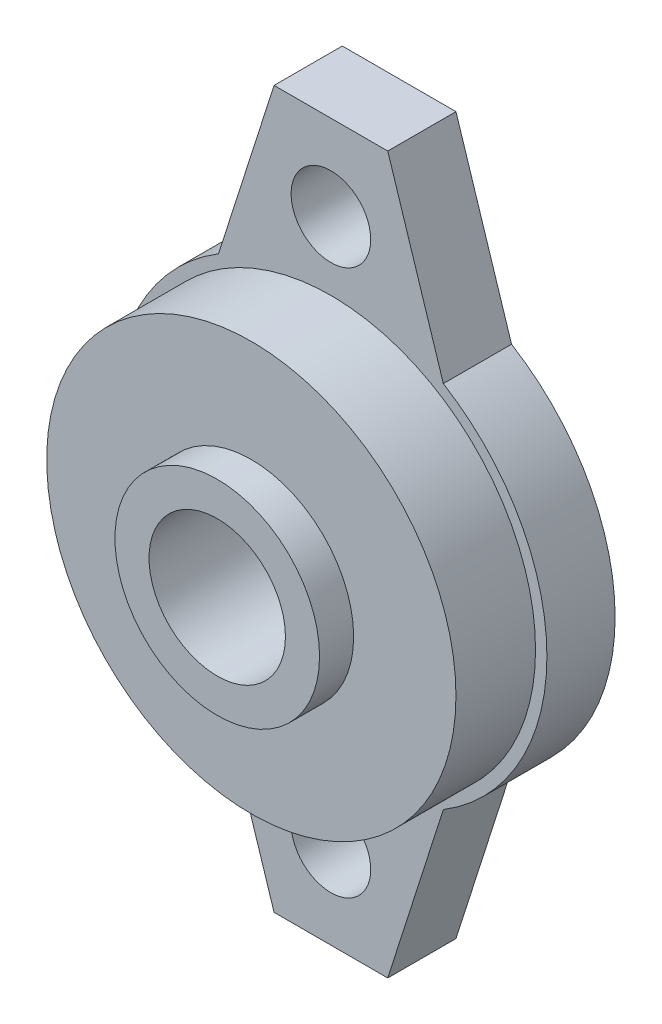
ISO-10303-21;
HEADER;
FILE_DESCRIPTION(('STEP AP214'),'2;1');
FILE_NAME('part.step','',(''),(''),'','','');
FILE_SCHEMA(('AUTOMOTIVE_DESIGN { 1 0 10303 214 1 1 1 1 }'));
ENDSEC;
DATA;
#1=APPLICATION_CONTEXT('core data for automotive mechanical design processes');
#2=APPLICATION_PROTOCOL_DEFINITION('international standard','automotive_design',2000,#1);
#3=PRODUCT_CONTEXT('',#1,'mechanical');
#4=PRODUCT('Part','Part','',(#3));
#5=PRODUCT_RELATED_PRODUCT_CATEGORY('part','',(#4));
#6=PRODUCT_DEFINITION_FORMATION('','',#4);
#7=PRODUCT_DEFINITION_CONTEXT('part definition',#1,'design');
#8=PRODUCT_DEFINITION('design','',#6,#7);
#9=PRODUCT_DEFINITION_SHAPE('','',#8);
#10=(LENGTH_UNIT() NAMED_UNIT(*) SI_UNIT(.MILLI.,.METRE.));
#11=(NAMED_UNIT(*) PLANE_ANGLE_UNIT() SI_UNIT($,.RADIAN.));
#12=(NAMED_UNIT(*) SI_UNIT($,.STERADIAN.) SOLID_ANGLE_UNIT());
#13=UNCERTAINTY_MEASURE_WITH_UNIT(LENGTH_MEASURE(1.E-05),#10,'distance_accuracy_value','');
#14=(GEOMETRIC_REPRESENTATION_CONTEXT(3) GLOBAL_UNCERTAINTY_ASSIGNED_CONTEXT((#13)) GLOBAL_UNIT_ASSIGNED_CONTEXT((#10,
#11,#12)) REPRESENTATION_CONTEXT('',''));
#15=CARTESIAN_POINT('',(0.,0.,0.));
#16=DIRECTION('',(0.,0.,1.));
#17=DIRECTION('',(1.,0.,0.));
#18=AXIS2_PLACEMENT_3D('',#15,#16,#17);
#19=CARTESIAN_POINT('',(0.,0.,6.));
#20=DIRECTION('',(0.,0.,1.));
#21=DIRECTION('',(1.,0.,0.));
#22=AXIS2_PLACEMENT_3D('',#19,#20,#21);
#23=PLANE('',#22);
#24=CARTESIAN_POINT('',(0.,0.,6.));
#25=DIRECTION('',(0.,0.,1.));
#26=DIRECTION('',(1.,0.,0.));
#27=AXIS2_PLACEMENT_3D('',#24,#25,#26);
#28=CIRCLE('',#27,18.);
#29=CARTESIAN_POINT('',(18.,0.,6.));
#30=VERTEX_POINT('',#29);
#31=EDGE_CURVE('E202',#30,#30,#28,.T.);
#32=ORIENTED_EDGE('',*,*,#31,.F.);
#33=EDGE_LOOP('',(#32));
#34=FACE_BOUND('',#33,.T.);
#35=CARTESIAN_POINT('',(0.,-24.,6.));
#36=DIRECTION('',(0.,0.,1.));
#37=DIRECTION('',(1.,0.,0.));
#38=AXIS2_PLACEMENT_3D('',#35,#36,#37);
#39=CIRCLE('',#38,3.5);
#40=CARTESIAN_POINT('',(3.5,-24.,6.));
#41=VERTEX_POINT('',#40);
#42=EDGE_CURVE('E190',#41,#41,#39,.T.);
#43=ORIENTED_EDGE('',*,*,#42,.F.);
#44=EDGE_LOOP('',(#43));
#45=FACE_BOUND('',#44,.T.);
#46=CARTESIAN_POINT('',(0.,0.,6.));
#47=DIRECTION('',(0.,0.,1.));
#48=DIRECTION('',(1.,0.,0.));
#49=AXIS2_PLACEMENT_3D('',#46,#47,#48);
#50=CIRCLE('',#49,19.);
#51=CARTESIAN_POINT('',(-9.8882838392303,16.2241130024053,6.));
#52=VERTEX_POINT('',#51);
#53=CARTESIAN_POINT('',(-9.8882838392303,-16.2241130024053,6.));
#54=VERTEX_POINT('',#53);
#55=EDGE_CURVE('E150',#52,#54,#50,.T.);
#56=ORIENTED_EDGE('',*,*,#55,.T.);
#57=DIRECTION('',(0.304775727103784,-0.952424147199324,0.));
#58=VECTOR('',#57,1.);
#59=CARTESIAN_POINT('',(-5.,-31.5,6.));
#60=LINE('',#59,#58);
#61=CARTESIAN_POINT('',(-5.,-31.5,6.));
#62=VERTEX_POINT('',#61);
#63=EDGE_CURVE('E98',#54,#62,#60,.T.);
#64=ORIENTED_EDGE('',*,*,#63,.T.);
#65=DIRECTION('',(1.,0.,0.));
#66=VECTOR('',#65,1.);
#67=CARTESIAN_POINT('',(-5.,-31.5,6.));
#68=LINE('',#67,#66);
#69=CARTESIAN_POINT('',(5.,-31.5,6.));
#70=VERTEX_POINT('',#69);
#71=EDGE_CURVE('E181',#62,#70,#68,.T.);
#72=ORIENTED_EDGE('',*,*,#71,.T.);
#73=DIRECTION('',(0.304775727103784,0.952424147199324,0.));
#74=VECTOR('',#73,1.);
#75=CARTESIAN_POINT('',(5.,-31.5,6.));
#76=LINE('',#75,#74);
#77=CARTESIAN_POINT('',(9.8882838392303,-16.2241130024053,6.));
#78=VERTEX_POINT('',#77);
#79=EDGE_CURVE('E180',#70,#78,#76,.T.);
#80=ORIENTED_EDGE('',*,*,#79,.T.);
#81=CARTESIAN_POINT('',(0.,0.,6.));
#82=DIRECTION('',(0.,0.,1.));
#83=DIRECTION('',(1.,0.,0.));
#84=AXIS2_PLACEMENT_3D('',#81,#82,#83);
#85=CIRCLE('',#84,19.);
#86=CARTESIAN_POINT('',(9.8882838392303,16.2241130024053,6.));
#87=VERTEX_POINT('',#86);
#88=EDGE_CURVE('E117',#78,#87,#85,.T.);
#89=ORIENTED_EDGE('',*,*,#88,.T.);
#90=DIRECTION('',(-0.304775727103784,0.952424147199324,0.));
#91=VECTOR('',#90,1.);
#92=CARTESIAN_POINT('',(5.,31.5,6.));
#93=LINE('',#92,#91);
#94=CARTESIAN_POINT('',(5.,31.5,6.));
#95=VERTEX_POINT('',#94);
#96=EDGE_CURVE('E111',#87,#95,#93,.T.);
#97=ORIENTED_EDGE('',*,*,#96,.T.);
#98=DIRECTION('',(-1.,0.,0.));
#99=VECTOR('',#98,1.);
#100=CARTESIAN_POINT('',(-5.,31.5,6.));
#101=LINE('',#100,#99);
#102=CARTESIAN_POINT('',(-5.,31.5,6.));
#103=VERTEX_POINT('',#102);
#104=EDGE_CURVE('E115',#95,#103,#101,.T.);
#105=ORIENTED_EDGE('',*,*,#104,.T.);
#106=DIRECTION('',(-0.304775727103784,-0.952424147199324,0.));
#107=VECTOR('',#106,1.);
#108=CARTESIAN_POINT('',(-5.,31.5,6.));
#109=LINE('',#108,#107);
#110=EDGE_CURVE('E54',#103,#52,#109,.T.);
#111=ORIENTED_EDGE('',*,*,#110,.T.);
#112=EDGE_LOOP('',(#56,#64,#72,#80,#89,#97,#105,#111));
#113=FACE_BOUND('',#112,.T.);
#114=CARTESIAN_POINT('',(0.,24.,6.));
#115=DIRECTION('',(0.,0.,1.));
#116=DIRECTION('',(1.,0.,0.));
#117=AXIS2_PLACEMENT_3D('',#114,#115,#116);
#118=CIRCLE('',#117,3.5);
#119=CARTESIAN_POINT('',(3.5,24.,6.));
#120=VERTEX_POINT('',#119);
#121=EDGE_CURVE('E139',#120,#120,#118,.T.);
#122=ORIENTED_EDGE('',*,*,#121,.F.);
#123=EDGE_LOOP('',(#122));
#124=FACE_BOUND('',#123,.T.);
#125=ADVANCED_FACE('F36',(#34,#45,#113,#124),#23,.T.);
#126=CARTESIAN_POINT('',(0.,0.,0.));
#127=DIRECTION('',(0.,0.,1.));
#128=DIRECTION('',(1.,0.,0.));
#129=AXIS2_PLACEMENT_3D('',#126,#127,#128);
#130=PLANE('',#129);
#131=CARTESIAN_POINT('',(0.,0.,0.));
#132=DIRECTION('',(0.,0.,1.));
#133=DIRECTION('',(1.,0.,0.));
#134=AXIS2_PLACEMENT_3D('',#131,#132,#133);
#135=CIRCLE('',#134,19.);
#136=CARTESIAN_POINT('',(-9.8882838392303,16.2241130024053,0.));
#137=VERTEX_POINT('',#136);
#138=CARTESIAN_POINT('',(-9.8882838392303,-16.2241130024053,0.));
#139=VERTEX_POINT('',#138);
#140=EDGE_CURVE('E135',#137,#139,#135,.T.);
#141=ORIENTED_EDGE('',*,*,#140,.F.);
#142=DIRECTION('',(-0.304775727103784,-0.952424147199324,0.));
#143=VECTOR('',#142,1.);
#144=CARTESIAN_POINT('',(-5.,31.5,0.));
#145=LINE('',#144,#143);
#146=CARTESIAN_POINT('',(-5.,31.5,0.));
#147=VERTEX_POINT('',#146);
#148=EDGE_CURVE('E89',#147,#137,#145,.T.);
#149=ORIENTED_EDGE('',*,*,#148,.F.);
#150=DIRECTION('',(-1.,0.,0.));
#151=VECTOR('',#150,1.);
#152=CARTESIAN_POINT('',(-5.,31.5,0.));
#153=LINE('',#152,#151);
#154=CARTESIAN_POINT('',(5.,31.5,0.));
#155=VERTEX_POINT('',#154);
#156=EDGE_CURVE('E83',#155,#147,#153,.T.);
#157=ORIENTED_EDGE('',*,*,#156,.F.);
#158=DIRECTION('',(-0.304775727103784,0.952424147199324,0.));
#159=VECTOR('',#158,1.);
#160=CARTESIAN_POINT('',(5.,31.5,0.));
#161=LINE('',#160,#159);
#162=CARTESIAN_POINT('',(9.8882838392303,16.2241130024053,0.));
#163=VERTEX_POINT('',#162);
#164=EDGE_CURVE('E125',#163,#155,#161,.T.);
#165=ORIENTED_EDGE('',*,*,#164,.F.);
#166=CARTESIAN_POINT('',(0.,0.,0.));
#167=DIRECTION('',(0.,0.,1.));
#168=DIRECTION('',(1.,0.,0.));
#169=AXIS2_PLACEMENT_3D('',#166,#167,#168);
#170=CIRCLE('',#169,19.);
#171=CARTESIAN_POINT('',(9.8882838392303,-16.2241130024053,0.));
#172=VERTEX_POINT('',#171);
#173=EDGE_CURVE('E145',#172,#163,#170,.T.);
#174=ORIENTED_EDGE('',*,*,#173,.F.);
#175=DIRECTION('',(0.304775727103784,0.952424147199324,0.));
#176=VECTOR('',#175,1.);
#177=CARTESIAN_POINT('',(5.,-31.5,0.));
#178=LINE('',#177,#176);
#179=CARTESIAN_POINT('',(5.,-31.5,0.));
#180=VERTEX_POINT('',#179);
#181=EDGE_CURVE('E143',#180,#172,#178,.T.);
#182=ORIENTED_EDGE('',*,*,#181,.F.);
#183=DIRECTION('',(1.,0.,0.));
#184=VECTOR('',#183,1.);
#185=CARTESIAN_POINT('',(-5.,-31.5,0.));
#186=LINE('',#185,#184);
#187=CARTESIAN_POINT('',(-5.,-31.5,0.));
#188=VERTEX_POINT('',#187);
#189=EDGE_CURVE('E141',#188,#180,#186,.T.);
#190=ORIENTED_EDGE('',*,*,#189,.F.);
#191=DIRECTION('',(0.304775727103784,-0.952424147199324,0.));
#192=VECTOR('',#191,1.);
#193=CARTESIAN_POINT('',(-5.,-31.5,0.));
#194=LINE('',#193,#192);
#195=EDGE_CURVE('E138',#139,#188,#194,.T.);
#196=ORIENTED_EDGE('',*,*,#195,.F.);
#197=EDGE_LOOP('',(#141,#149,#157,#165,#174,#182,#190,#196));
#198=FACE_BOUND('',#197,.T.);
#199=CARTESIAN_POINT('',(0.,24.,0.));
#200=DIRECTION('',(0.,0.,1.));
#201=DIRECTION('',(1.,0.,0.));
#202=AXIS2_PLACEMENT_3D('',#199,#200,#201);
#203=CIRCLE('',#202,3.5);
#204=CARTESIAN_POINT('',(3.5,24.,0.));
#205=VERTEX_POINT('',#204);
#206=EDGE_CURVE('E187',#205,#205,#203,.T.);
#207=ORIENTED_EDGE('',*,*,#206,.T.);
#208=EDGE_LOOP('',(#207));
#209=FACE_BOUND('',#208,.T.);
#210=CARTESIAN_POINT('',(0.,-24.,0.));
#211=DIRECTION('',(0.,0.,1.));
#212=DIRECTION('',(1.,0.,0.));
#213=AXIS2_PLACEMENT_3D('',#210,#211,#212);
#214=CIRCLE('',#213,3.5);
#215=CARTESIAN_POINT('',(3.5,-24.,0.));
#216=VERTEX_POINT('',#215);
#217=EDGE_CURVE('E193',#216,#216,#214,.T.);
#218=ORIENTED_EDGE('',*,*,#217,.T.);
#219=EDGE_LOOP('',(#218));
#220=FACE_BOUND('',#219,.T.);
#221=CARTESIAN_POINT('',(0.,0.,0.));
#222=DIRECTION('',(0.,0.,1.));
#223=DIRECTION('',(1.,0.,0.));
#224=AXIS2_PLACEMENT_3D('',#221,#222,#223);
#225=CIRCLE('',#224,6.);
#226=CARTESIAN_POINT('',(6.,0.,0.));
#227=VERTEX_POINT('',#226);
#228=EDGE_CURVE('E196',#227,#227,#225,.T.);
#229=ORIENTED_EDGE('',*,*,#228,.T.);
#230=EDGE_LOOP('',(#229));
#231=FACE_BOUND('',#230,.T.);
#232=ADVANCED_FACE('F170',(#198,#209,#220,#231),#130,.F.);
#233=CARTESIAN_POINT('',(0.,0.,6.));
#234=DIRECTION('',(0.,0.,-1.));
#235=DIRECTION('',(-1.,0.,0.));
#236=AXIS2_PLACEMENT_3D('',#233,#234,#235);
#237=CYLINDRICAL_SURFACE('',#236,19.);
#238=ORIENTED_EDGE('',*,*,#140,.T.);
#239=DIRECTION('',(0.,0.,-1.));
#240=VECTOR('',#239,1.);
#241=CARTESIAN_POINT('',(-9.8882838392303,-16.2241130024053,6.));
#242=LINE('',#241,#240);
#243=EDGE_CURVE('E40',#54,#139,#242,.T.);
#244=ORIENTED_EDGE('',*,*,#243,.F.);
#245=ORIENTED_EDGE('',*,*,#55,.F.);
#246=DIRECTION('',(0.,0.,-1.));
#247=VECTOR('',#246,1.);
#248=CARTESIAN_POINT('',(-9.8882838392303,16.2241130024053,6.));
#249=LINE('',#248,#247);
#250=EDGE_CURVE('E131',#52,#137,#249,.T.);
#251=ORIENTED_EDGE('',*,*,#250,.T.);
#252=EDGE_LOOP('',(#238,#244,#245,#251));
#253=FACE_BOUND('',#252,.T.);
#254=ADVANCED_FACE('F38',(#253),#237,.T.);
#255=CARTESIAN_POINT('',(-5.,-31.5,6.));
#256=DIRECTION('',(0.952424147199324,0.304775727103783,0.));
#257=DIRECTION('',(-0.304775727103783,0.952424147199324,0.));
#258=AXIS2_PLACEMENT_3D('',#255,#256,#257);
#259=PLANE('',#258);
#260=ORIENTED_EDGE('',*,*,#195,.T.);
#261=DIRECTION('',(0.,0.,-1.));
#262=VECTOR('',#261,1.);
#263=CARTESIAN_POINT('',(-5.,-31.5,6.));
#264=LINE('',#263,#262);
#265=EDGE_CURVE('E159',#62,#188,#264,.T.);
#266=ORIENTED_EDGE('',*,*,#265,.F.);
#267=ORIENTED_EDGE('',*,*,#63,.F.);
#268=ORIENTED_EDGE('',*,*,#243,.T.);
#269=EDGE_LOOP('',(#260,#266,#267,#268));
#270=FACE_BOUND('',#269,.T.);
#271=ADVANCED_FACE('F165',(#270),#259,.F.);
#272=CARTESIAN_POINT('',(-5.,-31.5,6.));
#273=DIRECTION('',(0.,1.,0.));
#274=DIRECTION('',(0.,0.,1.));
#275=AXIS2_PLACEMENT_3D('',#272,#273,#274);
#276=PLANE('',#275);
#277=ORIENTED_EDGE('',*,*,#189,.T.);
#278=DIRECTION('',(0.,0.,-1.));
#279=VECTOR('',#278,1.);
#280=CARTESIAN_POINT('',(5.,-31.5,6.));
#281=LINE('',#280,#279);
#282=EDGE_CURVE('E157',#70,#180,#281,.T.);
#283=ORIENTED_EDGE('',*,*,#282,.F.);
#284=ORIENTED_EDGE('',*,*,#71,.F.);
#285=ORIENTED_EDGE('',*,*,#265,.T.);
#286=EDGE_LOOP('',(#277,#283,#284,#285));
#287=FACE_BOUND('',#286,.T.);
#288=ADVANCED_FACE('F175',(#287),#276,.F.);
#289=CARTESIAN_POINT('',(5.,-31.5,6.));
#290=DIRECTION('',(-0.952424147199324,0.304775727103784,0.));
#291=DIRECTION('',(-0.304775727103784,-0.952424147199324,0.));
#292=AXIS2_PLACEMENT_3D('',#289,#290,#291);
#293=PLANE('',#292);
#294=ORIENTED_EDGE('',*,*,#181,.T.);
#295=DIRECTION('',(0.,0.,-1.));
#296=VECTOR('',#295,1.);
#297=CARTESIAN_POINT('',(9.8882838392303,-16.2241130024053,6.));
#298=LINE('',#297,#296);
#299=EDGE_CURVE('E154',#78,#172,#298,.T.);
#300=ORIENTED_EDGE('',*,*,#299,.F.);
#301=ORIENTED_EDGE('',*,*,#79,.F.);
#302=ORIENTED_EDGE('',*,*,#282,.T.);
#303=EDGE_LOOP('',(#294,#300,#301,#302));
#304=FACE_BOUND('',#303,.T.);
#305=ADVANCED_FACE('F178',(#304),#293,.F.);
#306=CARTESIAN_POINT('',(0.,0.,6.));
#307=DIRECTION('',(0.,0.,-1.));
#308=DIRECTION('',(-1.,0.,0.));
#309=AXIS2_PLACEMENT_3D('',#306,#307,#308);
#310=CYLINDRICAL_SURFACE('',#309,19.);
#311=ORIENTED_EDGE('',*,*,#173,.T.);
#312=DIRECTION('',(0.,0.,-1.));
#313=VECTOR('',#312,1.);
#314=CARTESIAN_POINT('',(9.8882838392303,16.2241130024053,6.));
#315=LINE('',#314,#313);
#316=EDGE_CURVE('E126',#87,#163,#315,.T.);
#317=ORIENTED_EDGE('',*,*,#316,.F.);
#318=ORIENTED_EDGE('',*,*,#88,.F.);
#319=ORIENTED_EDGE('',*,*,#299,.T.);
#320=EDGE_LOOP('',(#311,#317,#318,#319));
#321=FACE_BOUND('',#320,.T.);
#322=ADVANCED_FACE('F272',(#321),#310,.T.);
#323=CARTESIAN_POINT('',(5.,31.5,6.));
#324=DIRECTION('',(-0.952424147199324,-0.304775727103784,0.));
#325=DIRECTION('',(0.304775727103784,-0.952424147199324,0.));
#326=AXIS2_PLACEMENT_3D('',#323,#324,#325);
#327=PLANE('',#326);
#328=ORIENTED_EDGE('',*,*,#164,.T.);
#329=DIRECTION('',(0.,0.,-1.));
#330=VECTOR('',#329,1.);
#331=CARTESIAN_POINT('',(5.,31.5,6.));
#332=LINE('',#331,#330);
#333=EDGE_CURVE('E122',#95,#155,#332,.T.);
#334=ORIENTED_EDGE('',*,*,#333,.F.);
#335=ORIENTED_EDGE('',*,*,#96,.F.);
#336=ORIENTED_EDGE('',*,*,#316,.T.);
#337=EDGE_LOOP('',(#328,#334,#335,#336));
#338=FACE_BOUND('',#337,.T.);
#339=ADVANCED_FACE('F123',(#338),#327,.F.);
#340=CARTESIAN_POINT('',(-5.,31.5,6.));
#341=DIRECTION('',(0.,-1.,0.));
#342=DIRECTION('',(0.,0.,-1.));
#343=AXIS2_PLACEMENT_3D('',#340,#341,#342);
#344=PLANE('',#343);
#345=ORIENTED_EDGE('',*,*,#156,.T.);
#346=DIRECTION('',(0.,0.,-1.));
#347=VECTOR('',#346,1.);
#348=CARTESIAN_POINT('',(-5.,31.5,6.));
#349=LINE('',#348,#347);
#350=EDGE_CURVE('E127',#103,#147,#349,.T.);
#351=ORIENTED_EDGE('',*,*,#350,.F.);
#352=ORIENTED_EDGE('',*,*,#104,.F.);
#353=ORIENTED_EDGE('',*,*,#333,.T.);
#354=EDGE_LOOP('',(#345,#351,#352,#353));
#355=FACE_BOUND('',#354,.T.);
#356=ADVANCED_FACE('F129',(#355),#344,.F.);
#357=CARTESIAN_POINT('',(-5.,31.5,6.));
#358=DIRECTION('',(0.952424147199324,-0.304775727103784,0.));
#359=DIRECTION('',(0.304775727103784,0.952424147199324,0.));
#360=AXIS2_PLACEMENT_3D('',#357,#358,#359);
#361=PLANE('',#360);
#362=ORIENTED_EDGE('',*,*,#148,.T.);
#363=ORIENTED_EDGE('',*,*,#250,.F.);
#364=ORIENTED_EDGE('',*,*,#110,.F.);
#365=ORIENTED_EDGE('',*,*,#350,.T.);
#366=EDGE_LOOP('',(#362,#363,#364,#365));
#367=FACE_BOUND('',#366,.T.);
#368=ADVANCED_FACE('F263',(#367),#361,.F.);
#369=CARTESIAN_POINT('',(0.,24.,6.));
#370=DIRECTION('',(0.,0.,-1.));
#371=DIRECTION('',(-1.,0.,0.));
#372=AXIS2_PLACEMENT_3D('',#369,#370,#371);
#373=CYLINDRICAL_SURFACE('',#372,3.5);
#374=ORIENTED_EDGE('',*,*,#121,.T.);
#375=EDGE_LOOP('',(#374));
#376=FACE_BOUND('',#375,.T.);
#377=ORIENTED_EDGE('',*,*,#206,.F.);
#378=EDGE_LOOP('',(#377));
#379=FACE_BOUND('',#378,.T.);
#380=ADVANCED_FACE('F248',(#376,#379),#373,.F.);
#381=CARTESIAN_POINT('',(0.,-24.,6.));
#382=DIRECTION('',(0.,0.,-1.));
#383=DIRECTION('',(-1.,0.,0.));
#384=AXIS2_PLACEMENT_3D('',#381,#382,#383);
#385=CYLINDRICAL_SURFACE('',#384,3.5);
#386=ORIENTED_EDGE('',*,*,#42,.T.);
#387=EDGE_LOOP('',(#386));
#388=FACE_BOUND('',#387,.T.);
#389=ORIENTED_EDGE('',*,*,#217,.F.);
#390=EDGE_LOOP('',(#389));
#391=FACE_BOUND('',#390,.T.);
#392=ADVANCED_FACE('F245',(#388,#391),#385,.F.);
#393=CARTESIAN_POINT('',(0.,0.,6.));
#394=DIRECTION('',(0.,0.,-1.));
#395=DIRECTION('',(-1.,0.,0.));
#396=AXIS2_PLACEMENT_3D('',#393,#394,#395);
#397=CYLINDRICAL_SURFACE('',#396,6.);
#398=ORIENTED_EDGE('',*,*,#228,.F.);
#399=EDGE_LOOP('',(#398));
#400=FACE_BOUND('',#399,.T.);
#401=CARTESIAN_POINT('',(0.,0.,16.));
#402=DIRECTION('',(0.,0.,1.));
#403=DIRECTION('',(1.,0.,0.));
#404=AXIS2_PLACEMENT_3D('',#401,#402,#403);
#405=CIRCLE('',#404,6.);
#406=CARTESIAN_POINT('',(6.,0.,16.));
#407=VERTEX_POINT('',#406);
#408=EDGE_CURVE('E210',#407,#407,#405,.T.);
#409=ORIENTED_EDGE('',*,*,#408,.T.);
#410=EDGE_LOOP('',(#409));
#411=FACE_BOUND('',#410,.T.);
#412=ADVANCED_FACE('F214',(#400,#411),#397,.F.);
#413=CARTESIAN_POINT('',(0.,0.,13.));
#414=DIRECTION('',(0.,0.,-1.));
#415=DIRECTION('',(-1.,0.,0.));
#416=AXIS2_PLACEMENT_3D('',#413,#414,#415);
#417=CYLINDRICAL_SURFACE('',#416,18.);
#418=CARTESIAN_POINT('',(0.,0.,13.));
#419=DIRECTION('',(0.,0.,1.));
#420=DIRECTION('',(1.,0.,0.));
#421=AXIS2_PLACEMENT_3D('',#418,#419,#420);
#422=CIRCLE('',#421,18.);
#423=CARTESIAN_POINT('',(18.,0.,13.));
#424=VERTEX_POINT('',#423);
#425=EDGE_CURVE('E201',#424,#424,#422,.T.);
#426=ORIENTED_EDGE('',*,*,#425,.F.);
#427=EDGE_LOOP('',(#426));
#428=FACE_BOUND('',#427,.T.);
#429=ORIENTED_EDGE('',*,*,#31,.T.);
#430=EDGE_LOOP('',(#429));
#431=FACE_BOUND('',#430,.T.);
#432=ADVANCED_FACE('F231',(#428,#431),#417,.T.);
#433=CARTESIAN_POINT('',(0.,0.,13.));
#434=DIRECTION('',(0.,0.,1.));
#435=DIRECTION('',(1.,0.,0.));
#436=AXIS2_PLACEMENT_3D('',#433,#434,#435);
#437=PLANE('',#436);
#438=CARTESIAN_POINT('',(0.,0.,13.));
#439=DIRECTION('',(0.,0.,1.));
#440=DIRECTION('',(1.,0.,0.));
#441=AXIS2_PLACEMENT_3D('',#438,#439,#440);
#442=CIRCLE('',#441,9.);
#443=CARTESIAN_POINT('',(9.,0.,13.));
#444=VERTEX_POINT('',#443);
#445=EDGE_CURVE('E11',#444,#444,#442,.T.);
#446=ORIENTED_EDGE('',*,*,#445,.F.);
#447=EDGE_LOOP('',(#446));
#448=FACE_BOUND('',#447,.T.);
#449=ORIENTED_EDGE('',*,*,#425,.T.);
#450=EDGE_LOOP('',(#449));
#451=FACE_BOUND('',#450,.T.);
#452=ADVANCED_FACE('F225',(#448,#451),#437,.T.);
#453=CARTESIAN_POINT('',(0.,0.,16.));
#454=DIRECTION('',(0.,0.,-1.));
#455=DIRECTION('',(-1.,0.,0.));
#456=AXIS2_PLACEMENT_3D('',#453,#454,#455);
#457=CYLINDRICAL_SURFACE('',#456,9.);
#458=CARTESIAN_POINT('',(0.,0.,16.));
#459=DIRECTION('',(0.,0.,1.));
#460=DIRECTION('',(1.,0.,0.));
#461=AXIS2_PLACEMENT_3D('',#458,#459,#460);
#462=CIRCLE('',#461,9.);
#463=CARTESIAN_POINT('',(9.,0.,16.));
#464=VERTEX_POINT('',#463);
#465=EDGE_CURVE('E205',#464,#464,#462,.T.);
#466=ORIENTED_EDGE('',*,*,#465,.F.);
#467=EDGE_LOOP('',(#466));
#468=FACE_BOUND('',#467,.T.);
#469=ORIENTED_EDGE('',*,*,#445,.T.);
#470=EDGE_LOOP('',(#469));
#471=FACE_BOUND('',#470,.T.);
#472=ADVANCED_FACE('F219',(#468,#471),#457,.T.);
#473=CARTESIAN_POINT('',(0.,0.,16.));
#474=DIRECTION('',(0.,0.,1.));
#475=DIRECTION('',(1.,0.,0.));
#476=AXIS2_PLACEMENT_3D('',#473,#474,#475);
#477=PLANE('',#476);
#478=ORIENTED_EDGE('',*,*,#408,.F.);
#479=EDGE_LOOP('',(#478));
#480=FACE_BOUND('',#479,.T.);
#481=ORIENTED_EDGE('',*,*,#465,.T.);
#482=EDGE_LOOP('',(#481));
#483=FACE_BOUND('',#482,.T.);
#484=ADVANCED_FACE('F216',(#480,#483),#477,.T.);
#485=CLOSED_SHELL('',(#125,#232,#254,#271,#288,#305,#322,#339,#356,#368,#380,#392,#412,#432,
#452,#472,#484));
#486=MANIFOLD_SOLID_BREP('B2',#485);
#487=ADVANCED_BREP_SHAPE_REPRESENTATION('',(#18,#486),#14);
#488=SHAPE_DEFINITION_REPRESENTATION(#9,#487);
ENDSEC;
END-ISO-10303-21;
